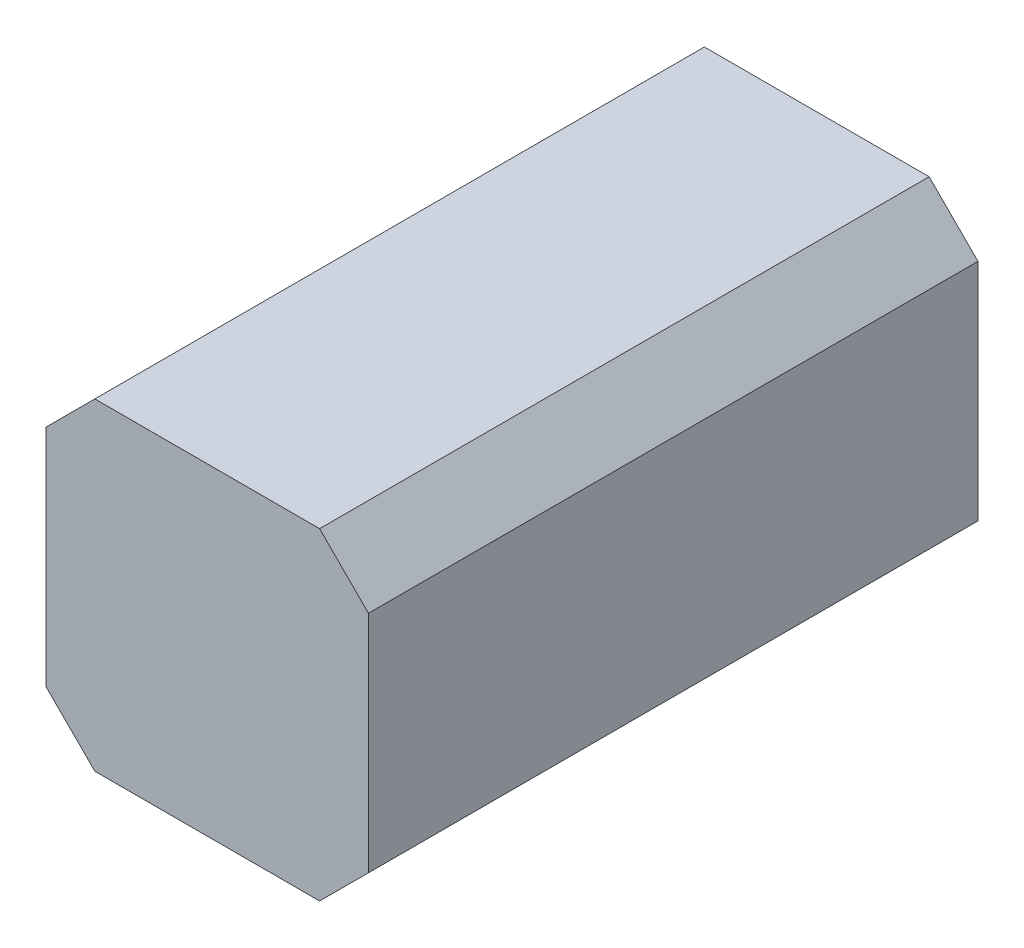
ISO-10303-21;
HEADER;
FILE_DESCRIPTION(('STEP AP214'),'2;1');
FILE_NAME('part.step','',(''),(''),'','','');
FILE_SCHEMA(('AUTOMOTIVE_DESIGN { 1 0 10303 214 1 1 1 1 }'));
ENDSEC;
DATA;
#1=APPLICATION_CONTEXT('core data for automotive mechanical design processes');
#2=APPLICATION_PROTOCOL_DEFINITION('international standard','automotive_design',2000,#1);
#3=PRODUCT_CONTEXT('',#1,'mechanical');
#4=PRODUCT('Part','Part','',(#3));
#5=PRODUCT_RELATED_PRODUCT_CATEGORY('part','',(#4));
#6=PRODUCT_DEFINITION_FORMATION('','',#4);
#7=PRODUCT_DEFINITION_CONTEXT('part definition',#1,'design');
#8=PRODUCT_DEFINITION('design','',#6,#7);
#9=PRODUCT_DEFINITION_SHAPE('','',#8);
#10=(LENGTH_UNIT() NAMED_UNIT(*) SI_UNIT(.MILLI.,.METRE.));
#11=(NAMED_UNIT(*) PLANE_ANGLE_UNIT() SI_UNIT($,.RADIAN.));
#12=(NAMED_UNIT(*) SI_UNIT($,.STERADIAN.) SOLID_ANGLE_UNIT());
#13=UNCERTAINTY_MEASURE_WITH_UNIT(LENGTH_MEASURE(1.E-05),#10,'distance_accuracy_value','');
#14=(GEOMETRIC_REPRESENTATION_CONTEXT(3) GLOBAL_UNCERTAINTY_ASSIGNED_CONTEXT((#13)) GLOBAL_UNIT_ASSIGNED_CONTEXT((#10,
#11,#12)) REPRESENTATION_CONTEXT('',''));
#15=CARTESIAN_POINT('',(0.,0.,0.));
#16=DIRECTION('',(0.,0.,1.));
#17=DIRECTION('',(1.,0.,0.));
#18=AXIS2_PLACEMENT_3D('',#15,#16,#17);
#19=CARTESIAN_POINT('',(-26.3043722601398,-26.3043722601393,117.2));
#20=DIRECTION('',(-0.707106781186554,-0.70710678118654,0.));
#21=DIRECTION('',(0.707106781186541,-0.707106781186555,0.));
#22=AXIS2_PLACEMENT_3D('',#19,#20,#21);
#23=PLANE('',#22);
#24=DIRECTION('',(-0.707106781186541,0.707106781186555,0.));
#25=VECTOR('',#24,1.);
#26=CARTESIAN_POINT('',(-26.3043722601398,-26.3043722601393,0.));
#27=LINE('',#26,#25);
#28=CARTESIAN_POINT('',(-21.6087445202792,-31.,0.));
#29=VERTEX_POINT('',#28);
#30=CARTESIAN_POINT('',(-31.,-21.608744520279,0.));
#31=VERTEX_POINT('',#30);
#32=EDGE_CURVE('E130',#29,#31,#27,.T.);
#33=ORIENTED_EDGE('',*,*,#32,.F.);
#34=DIRECTION('',(0.,0.,-1.));
#35=VECTOR('',#34,1.);
#36=CARTESIAN_POINT('',(-21.6087445202792,-31.,117.2));
#37=LINE('',#36,#35);
#38=CARTESIAN_POINT('',(-21.6087445202792,-31.,117.2));
#39=VERTEX_POINT('',#38);
#40=EDGE_CURVE('E11',#39,#29,#37,.T.);
#41=ORIENTED_EDGE('',*,*,#40,.F.);
#42=DIRECTION('',(-0.707106781186541,0.707106781186555,0.));
#43=VECTOR('',#42,1.);
#44=CARTESIAN_POINT('',(-26.3043722601398,-26.3043722601393,117.2));
#45=LINE('',#44,#43);
#46=CARTESIAN_POINT('',(-31.,-21.608744520279,117.2));
#47=VERTEX_POINT('',#46);
#48=EDGE_CURVE('E150',#39,#47,#45,.T.);
#49=ORIENTED_EDGE('',*,*,#48,.T.);
#50=DIRECTION('',(0.,0.,-1.));
#51=VECTOR('',#50,1.);
#52=CARTESIAN_POINT('',(-31.,-21.608744520279,117.2));
#53=LINE('',#52,#51);
#54=EDGE_CURVE('E53',#47,#31,#53,.T.);
#55=ORIENTED_EDGE('',*,*,#54,.T.);
#56=EDGE_LOOP('',(#33,#41,#49,#55));
#57=FACE_BOUND('',#56,.T.);
#58=ADVANCED_FACE('F37',(#57),#23,.T.);
#59=CARTESIAN_POINT('',(0.,-31.,117.2));
#60=DIRECTION('',(0.,1.,0.));
#61=DIRECTION('',(0.,0.,1.));
#62=AXIS2_PLACEMENT_3D('',#59,#60,#61);
#63=PLANE('',#62);
#64=DIRECTION('',(1.,0.,0.));
#65=VECTOR('',#64,1.);
#66=CARTESIAN_POINT('',(0.,-31.,0.));
#67=LINE('',#66,#65);
#68=CARTESIAN_POINT('',(21.6087445202791,-31.,0.));
#69=VERTEX_POINT('',#68);
#70=EDGE_CURVE('E132',#29,#69,#67,.T.);
#71=ORIENTED_EDGE('',*,*,#70,.T.);
#72=DIRECTION('',(0.,0.,-1.));
#73=VECTOR('',#72,1.);
#74=CARTESIAN_POINT('',(21.6087445202791,-31.,117.2));
#75=LINE('',#74,#73);
#76=CARTESIAN_POINT('',(21.6087445202791,-31.,117.2));
#77=VERTEX_POINT('',#76);
#78=EDGE_CURVE('E45',#77,#69,#75,.T.);
#79=ORIENTED_EDGE('',*,*,#78,.F.);
#80=DIRECTION('',(1.,0.,0.));
#81=VECTOR('',#80,1.);
#82=CARTESIAN_POINT('',(0.,-31.,117.2));
#83=LINE('',#82,#81);
#84=EDGE_CURVE('E177',#39,#77,#83,.T.);
#85=ORIENTED_EDGE('',*,*,#84,.F.);
#86=ORIENTED_EDGE('',*,*,#40,.T.);
#87=EDGE_LOOP('',(#71,#79,#85,#86));
#88=FACE_BOUND('',#87,.T.);
#89=ADVANCED_FACE('F166',(#88),#63,.F.);
#90=CARTESIAN_POINT('',(26.3043722601394,-26.3043722601397,117.2));
#91=DIRECTION('',(0.707106781186543,-0.707106781186552,0.));
#92=DIRECTION('',(0.707106781186552,0.707106781186543,0.));
#93=AXIS2_PLACEMENT_3D('',#90,#91,#92);
#94=PLANE('',#93);
#95=DIRECTION('',(-0.707106781186552,-0.707106781186543,0.));
#96=VECTOR('',#95,1.);
#97=CARTESIAN_POINT('',(26.3043722601394,-26.3043722601397,0.));
#98=LINE('',#97,#96);
#99=CARTESIAN_POINT('',(31.,-21.6087445202792,0.));
#100=VERTEX_POINT('',#99);
#101=EDGE_CURVE('E135',#100,#69,#98,.T.);
#102=ORIENTED_EDGE('',*,*,#101,.F.);
#103=DIRECTION('',(0.,0.,-1.));
#104=VECTOR('',#103,1.);
#105=CARTESIAN_POINT('',(31.,-21.6087445202792,117.2));
#106=LINE('',#105,#104);
#107=CARTESIAN_POINT('',(31.,-21.6087445202792,117.2));
#108=VERTEX_POINT('',#107);
#109=EDGE_CURVE('E156',#108,#100,#106,.T.);
#110=ORIENTED_EDGE('',*,*,#109,.F.);
#111=DIRECTION('',(-0.707106781186552,-0.707106781186543,0.));
#112=VECTOR('',#111,1.);
#113=CARTESIAN_POINT('',(26.3043722601394,-26.3043722601397,117.2));
#114=LINE('',#113,#112);
#115=EDGE_CURVE('E163',#108,#77,#114,.T.);
#116=ORIENTED_EDGE('',*,*,#115,.T.);
#117=ORIENTED_EDGE('',*,*,#78,.T.);
#118=EDGE_LOOP('',(#102,#110,#116,#117));
#119=FACE_BOUND('',#118,.T.);
#120=ADVANCED_FACE('F161',(#119),#94,.T.);
#121=CARTESIAN_POINT('',(31.,0.,117.2));
#122=DIRECTION('',(-1.,0.,0.));
#123=DIRECTION('',(0.,0.,1.));
#124=AXIS2_PLACEMENT_3D('',#121,#122,#123);
#125=PLANE('',#124);
#126=DIRECTION('',(0.,1.,0.));
#127=VECTOR('',#126,1.);
#128=CARTESIAN_POINT('',(31.,0.,0.));
#129=LINE('',#128,#127);
#130=CARTESIAN_POINT('',(31.,21.6087445202791,0.));
#131=VERTEX_POINT('',#130);
#132=EDGE_CURVE('E138',#100,#131,#129,.T.);
#133=ORIENTED_EDGE('',*,*,#132,.T.);
#134=DIRECTION('',(0.,0.,-1.));
#135=VECTOR('',#134,1.);
#136=CARTESIAN_POINT('',(31.,21.6087445202791,117.2));
#137=LINE('',#136,#135);
#138=CARTESIAN_POINT('',(31.,21.6087445202791,117.2));
#139=VERTEX_POINT('',#138);
#140=EDGE_CURVE('E154',#139,#131,#137,.T.);
#141=ORIENTED_EDGE('',*,*,#140,.F.);
#142=DIRECTION('',(0.,1.,0.));
#143=VECTOR('',#142,1.);
#144=CARTESIAN_POINT('',(31.,0.,117.2));
#145=LINE('',#144,#143);
#146=EDGE_CURVE('E175',#108,#139,#145,.T.);
#147=ORIENTED_EDGE('',*,*,#146,.F.);
#148=ORIENTED_EDGE('',*,*,#109,.T.);
#149=EDGE_LOOP('',(#133,#141,#147,#148));
#150=FACE_BOUND('',#149,.T.);
#151=ADVANCED_FACE('F173',(#150),#125,.F.);
#152=CARTESIAN_POINT('',(26.3043722601396,26.3043722601395,117.2));
#153=DIRECTION('',(0.707106781186549,0.707106781186546,0.));
#154=DIRECTION('',(-0.707106781186546,0.707106781186549,0.));
#155=AXIS2_PLACEMENT_3D('',#152,#153,#154);
#156=PLANE('',#155);
#157=DIRECTION('',(0.707106781186546,-0.707106781186549,0.));
#158=VECTOR('',#157,1.);
#159=CARTESIAN_POINT('',(26.3043722601396,26.3043722601395,0.));
#160=LINE('',#159,#158);
#161=CARTESIAN_POINT('',(21.6087445202792,31.,0.));
#162=VERTEX_POINT('',#161);
#163=EDGE_CURVE('E141',#162,#131,#160,.T.);
#164=ORIENTED_EDGE('',*,*,#163,.F.);
#165=DIRECTION('',(0.,0.,-1.));
#166=VECTOR('',#165,1.);
#167=CARTESIAN_POINT('',(21.6087445202792,31.,117.2));
#168=LINE('',#167,#166);
#169=CARTESIAN_POINT('',(21.6087445202792,31.,117.2));
#170=VERTEX_POINT('',#169);
#171=EDGE_CURVE('E112',#170,#162,#168,.T.);
#172=ORIENTED_EDGE('',*,*,#171,.F.);
#173=DIRECTION('',(0.707106781186546,-0.707106781186549,0.));
#174=VECTOR('',#173,1.);
#175=CARTESIAN_POINT('',(26.3043722601396,26.3043722601395,117.2));
#176=LINE('',#175,#174);
#177=EDGE_CURVE('E122',#170,#139,#176,.T.);
#178=ORIENTED_EDGE('',*,*,#177,.T.);
#179=ORIENTED_EDGE('',*,*,#140,.T.);
#180=EDGE_LOOP('',(#164,#172,#178,#179));
#181=FACE_BOUND('',#180,.T.);
#182=ADVANCED_FACE('F182',(#181),#156,.T.);
#183=CARTESIAN_POINT('',(0.,31.,117.2));
#184=DIRECTION('',(0.,1.,0.));
#185=DIRECTION('',(0.,0.,1.));
#186=AXIS2_PLACEMENT_3D('',#183,#184,#185);
#187=PLANE('',#186);
#188=DIRECTION('',(1.,0.,0.));
#189=VECTOR('',#188,1.);
#190=CARTESIAN_POINT('',(0.,31.,0.));
#191=LINE('',#190,#189);
#192=CARTESIAN_POINT('',(-21.6087445202791,31.,0.));
#193=VERTEX_POINT('',#192);
#194=EDGE_CURVE('E108',#193,#162,#191,.T.);
#195=ORIENTED_EDGE('',*,*,#194,.F.);
#196=DIRECTION('',(0.,0.,-1.));
#197=VECTOR('',#196,1.);
#198=CARTESIAN_POINT('',(-21.6087445202791,31.,117.2));
#199=LINE('',#198,#197);
#200=CARTESIAN_POINT('',(-21.6087445202791,31.,117.2));
#201=VERTEX_POINT('',#200);
#202=EDGE_CURVE('E103',#201,#193,#199,.T.);
#203=ORIENTED_EDGE('',*,*,#202,.F.);
#204=DIRECTION('',(1.,0.,0.));
#205=VECTOR('',#204,1.);
#206=CARTESIAN_POINT('',(0.,31.,117.2));
#207=LINE('',#206,#205);
#208=EDGE_CURVE('E106',#201,#170,#207,.T.);
#209=ORIENTED_EDGE('',*,*,#208,.T.);
#210=ORIENTED_EDGE('',*,*,#171,.T.);
#211=EDGE_LOOP('',(#195,#203,#209,#210));
#212=FACE_BOUND('',#211,.T.);
#213=ADVANCED_FACE('F105',(#212),#187,.T.);
#214=CARTESIAN_POINT('',(-26.3043722601396,26.3043722601395,117.2));
#215=DIRECTION('',(-0.707106781186548,0.707106781186547,0.));
#216=DIRECTION('',(-0.707106781186547,-0.707106781186548,0.));
#217=AXIS2_PLACEMENT_3D('',#214,#215,#216);
#218=PLANE('',#217);
#219=DIRECTION('',(0.707106781186547,0.707106781186548,0.));
#220=VECTOR('',#219,1.);
#221=CARTESIAN_POINT('',(-26.3043722601396,26.3043722601395,0.));
#222=LINE('',#221,#220);
#223=CARTESIAN_POINT('',(-31.,21.6087445202791,0.));
#224=VERTEX_POINT('',#223);
#225=EDGE_CURVE('E145',#224,#193,#222,.T.);
#226=ORIENTED_EDGE('',*,*,#225,.F.);
#227=DIRECTION('',(0.,0.,-1.));
#228=VECTOR('',#227,1.);
#229=CARTESIAN_POINT('',(-31.,21.6087445202791,117.2));
#230=LINE('',#229,#228);
#231=CARTESIAN_POINT('',(-31.,21.6087445202791,117.2));
#232=VERTEX_POINT('',#231);
#233=EDGE_CURVE('E78',#232,#224,#230,.T.);
#234=ORIENTED_EDGE('',*,*,#233,.F.);
#235=DIRECTION('',(0.707106781186547,0.707106781186548,0.));
#236=VECTOR('',#235,1.);
#237=CARTESIAN_POINT('',(-26.3043722601396,26.3043722601395,117.2));
#238=LINE('',#237,#236);
#239=EDGE_CURVE('E120',#232,#201,#238,.T.);
#240=ORIENTED_EDGE('',*,*,#239,.T.);
#241=ORIENTED_EDGE('',*,*,#202,.T.);
#242=EDGE_LOOP('',(#226,#234,#240,#241));
#243=FACE_BOUND('',#242,.T.);
#244=ADVANCED_FACE('F124',(#243),#218,.T.);
#245=CARTESIAN_POINT('',(-31.,0.,117.2));
#246=DIRECTION('',(-1.,0.,0.));
#247=DIRECTION('',(0.,0.,1.));
#248=AXIS2_PLACEMENT_3D('',#245,#246,#247);
#249=PLANE('',#248);
#250=DIRECTION('',(0.,1.,0.));
#251=VECTOR('',#250,1.);
#252=CARTESIAN_POINT('',(-31.,0.,0.));
#253=LINE('',#252,#251);
#254=EDGE_CURVE('E147',#31,#224,#253,.T.);
#255=ORIENTED_EDGE('',*,*,#254,.F.);
#256=ORIENTED_EDGE('',*,*,#54,.F.);
#257=DIRECTION('',(0.,1.,0.));
#258=VECTOR('',#257,1.);
#259=CARTESIAN_POINT('',(-31.,0.,117.2));
#260=LINE('',#259,#258);
#261=EDGE_CURVE('E125',#47,#232,#260,.T.);
#262=ORIENTED_EDGE('',*,*,#261,.T.);
#263=ORIENTED_EDGE('',*,*,#233,.T.);
#264=EDGE_LOOP('',(#255,#256,#262,#263));
#265=FACE_BOUND('',#264,.T.);
#266=ADVANCED_FACE('F183',(#265),#249,.T.);
#267=CARTESIAN_POINT('',(0.,0.,117.2));
#268=DIRECTION('',(0.,0.,1.));
#269=DIRECTION('',(1.,0.,0.));
#270=AXIS2_PLACEMENT_3D('',#267,#268,#269);
#271=PLANE('',#270);
#272=ORIENTED_EDGE('',*,*,#48,.F.);
#273=ORIENTED_EDGE('',*,*,#84,.T.);
#274=ORIENTED_EDGE('',*,*,#115,.F.);
#275=ORIENTED_EDGE('',*,*,#146,.T.);
#276=ORIENTED_EDGE('',*,*,#177,.F.);
#277=ORIENTED_EDGE('',*,*,#208,.F.);
#278=ORIENTED_EDGE('',*,*,#239,.F.);
#279=ORIENTED_EDGE('',*,*,#261,.F.);
#280=EDGE_LOOP('',(#272,#273,#274,#275,#276,#277,#278,#279));
#281=FACE_BOUND('',#280,.T.);
#282=ADVANCED_FACE('F118',(#281),#271,.T.);
#283=CARTESIAN_POINT('',(0.,0.,0.));
#284=DIRECTION('',(0.,0.,1.));
#285=DIRECTION('',(1.,0.,0.));
#286=AXIS2_PLACEMENT_3D('',#283,#284,#285);
#287=PLANE('',#286);
#288=ORIENTED_EDGE('',*,*,#32,.T.);
#289=ORIENTED_EDGE('',*,*,#254,.T.);
#290=ORIENTED_EDGE('',*,*,#225,.T.);
#291=ORIENTED_EDGE('',*,*,#194,.T.);
#292=ORIENTED_EDGE('',*,*,#163,.T.);
#293=ORIENTED_EDGE('',*,*,#132,.F.);
#294=ORIENTED_EDGE('',*,*,#101,.T.);
#295=ORIENTED_EDGE('',*,*,#70,.F.);
#296=EDGE_LOOP('',(#288,#289,#290,#291,#292,#293,#294,#295));
#297=FACE_BOUND('',#296,.T.);
#298=ADVANCED_FACE('F169',(#297),#287,.F.);
#299=CLOSED_SHELL('',(#58,#89,#120,#151,#182,#213,#244,#266,#282,#298));
#300=MANIFOLD_SOLID_BREP('B2',#299);
#301=ADVANCED_BREP_SHAPE_REPRESENTATION('',(#18,#300),#14);
#302=SHAPE_DEFINITION_REPRESENTATION(#9,#301);
ENDSEC;
END-ISO-10303-21;
